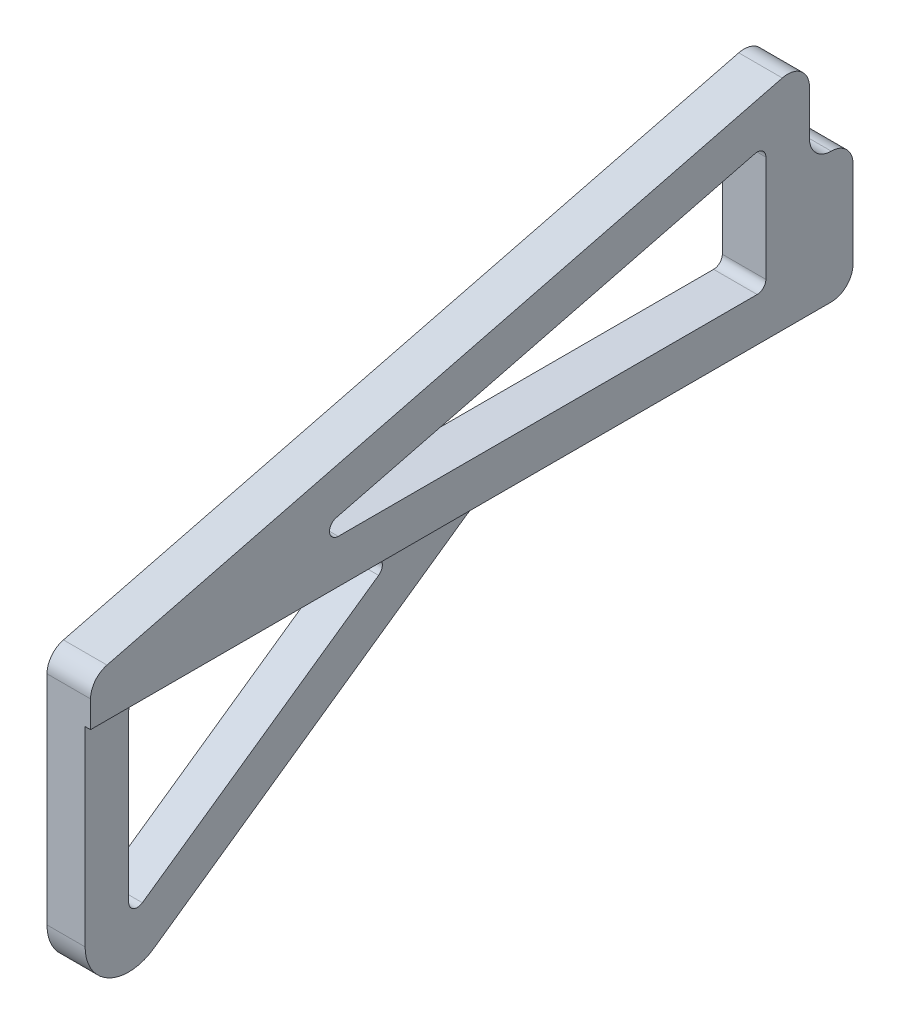
ISO-10303-21;
HEADER;
FILE_DESCRIPTION(('STEP AP214'),'2;1');
FILE_NAME('part.step','',(''),(''),'','','');
FILE_SCHEMA(('AUTOMOTIVE_DESIGN { 1 0 10303 214 1 1 1 1 }'));
ENDSEC;
DATA;
#1=APPLICATION_CONTEXT('core data for automotive mechanical design processes');
#2=APPLICATION_PROTOCOL_DEFINITION('international standard','automotive_design',2000,#1);
#3=PRODUCT_CONTEXT('',#1,'mechanical');
#4=PRODUCT('Part','Part','',(#3));
#5=PRODUCT_RELATED_PRODUCT_CATEGORY('part','',(#4));
#6=PRODUCT_DEFINITION_FORMATION('','',#4);
#7=PRODUCT_DEFINITION_CONTEXT('part definition',#1,'design');
#8=PRODUCT_DEFINITION('design','',#6,#7);
#9=PRODUCT_DEFINITION_SHAPE('','',#8);
#10=(LENGTH_UNIT() NAMED_UNIT(*) SI_UNIT(.MILLI.,.METRE.));
#11=(NAMED_UNIT(*) PLANE_ANGLE_UNIT() SI_UNIT($,.RADIAN.));
#12=(NAMED_UNIT(*) SI_UNIT($,.STERADIAN.) SOLID_ANGLE_UNIT());
#13=UNCERTAINTY_MEASURE_WITH_UNIT(LENGTH_MEASURE(1.E-05),#10,'distance_accuracy_value','');
#14=(GEOMETRIC_REPRESENTATION_CONTEXT(3) GLOBAL_UNCERTAINTY_ASSIGNED_CONTEXT((#13)) GLOBAL_UNIT_ASSIGNED_CONTEXT((#10,
#11,#12)) REPRESENTATION_CONTEXT('',''));
#15=CARTESIAN_POINT('',(0.,0.,0.));
#16=DIRECTION('',(0.,0.,1.));
#17=DIRECTION('',(1.,0.,0.));
#18=AXIS2_PLACEMENT_3D('',#15,#16,#17);
#19=CARTESIAN_POINT('',(0.,-156.794285130241,-10.8702420872809));
#20=DIRECTION('',(1.,0.,0.));
#21=DIRECTION('',(0.,0.,-1.));
#22=AXIS2_PLACEMENT_3D('',#19,#20,#21);
#23=PLANE('',#22);
#24=DIRECTION('',(0.,0.245169857615368,-0.969480139516463));
#25=VECTOR('',#24,1.);
#26=CARTESIAN_POINT('',(0.,-58.2070633333334,228.6));
#27=LINE('',#26,#25);
#28=CARTESIAN_POINT('',(0.,-56.9949279808075,223.806828595858));
#29=VERTEX_POINT('',#28);
#30=CARTESIAN_POINT('',(0.,-7.21393247154817,26.9568285958576));
#31=VERTEX_POINT('',#30);
#32=EDGE_CURVE('E211',#29,#31,#27,.T.);
#33=ORIENTED_EDGE('',*,*,#32,.F.);
#34=CARTESIAN_POINT('',(0.,-63.151126866737,222.25));
#35=DIRECTION('',(1.,0.,0.));
#36=DIRECTION('',(0.,0.,-1.));
#37=AXIS2_PLACEMENT_3D('',#34,#35,#36);
#38=CIRCLE('',#37,6.35);
#39=CARTESIAN_POINT('',(0.,-63.151126866737,228.6));
#40=VERTEX_POINT('',#39);
#41=EDGE_CURVE('E282',#40,#29,#38,.F.);
#42=ORIENTED_EDGE('',*,*,#41,.F.);
#43=DIRECTION('',(0.,1.,0.));
#44=VECTOR('',#43,1.);
#45=CARTESIAN_POINT('',(0.,-70.9070633333334,228.6));
#46=LINE('',#45,#44);
#47=CARTESIAN_POINT('',(0.,-70.9070633333334,228.6));
#48=VERTEX_POINT('',#47);
#49=EDGE_CURVE('E220',#48,#40,#46,.T.);
#50=ORIENTED_EDGE('',*,*,#49,.F.);
#51=DIRECTION('',(0.,0.,1.));
#52=VECTOR('',#51,1.);
#53=CARTESIAN_POINT('',(0.,-70.9070633333333,0.));
#54=LINE('',#53,#52);
#55=CARTESIAN_POINT('',(0.,-70.9070633333335,12.7));
#56=VERTEX_POINT('',#55);
#57=EDGE_CURVE('E219',#56,#48,#54,.T.);
#58=ORIENTED_EDGE('',*,*,#57,.F.);
#59=CARTESIAN_POINT('',(0.,-64.5570633333333,12.7));
#60=DIRECTION('',(1.,0.,0.));
#61=DIRECTION('',(0.,0.,-1.));
#62=AXIS2_PLACEMENT_3D('',#59,#60,#61);
#63=CIRCLE('',#62,6.35);
#64=CARTESIAN_POINT('',(0.,-64.5570633333333,6.35));
#65=VERTEX_POINT('',#64);
#66=EDGE_CURVE('E235',#56,#65,#63,.T.);
#67=ORIENTED_EDGE('',*,*,#66,.T.);
#68=DIRECTION('',(0.,-1.,0.));
#69=VECTOR('',#68,1.);
#70=CARTESIAN_POINT('',(0.,-70.9070633333333,6.35));
#71=LINE('',#70,#69);
#72=CARTESIAN_POINT('',(0.,-39.1570633333333,6.35));
#73=VERTEX_POINT('',#72);
#74=EDGE_CURVE('E44',#73,#65,#71,.T.);
#75=ORIENTED_EDGE('',*,*,#74,.F.);
#76=CARTESIAN_POINT('',(0.,-39.1570633333333,12.7));
#77=DIRECTION('',(1.,0.,0.));
#78=DIRECTION('',(0.,0.,-1.));
#79=AXIS2_PLACEMENT_3D('',#76,#77,#78);
#80=CIRCLE('',#79,6.35);
#81=CARTESIAN_POINT('',(0.,-32.8070633333333,12.7));
#82=VERTEX_POINT('',#81);
#83=EDGE_CURVE('E301',#73,#82,#80,.T.);
#84=ORIENTED_EDGE('',*,*,#83,.T.);
#85=CARTESIAN_POINT('',(0.,-26.4570633333333,12.7));
#86=DIRECTION('',(1.,0.,0.));
#87=DIRECTION('',(0.,0.,-1.));
#88=AXIS2_PLACEMENT_3D('',#85,#86,#87);
#89=CIRCLE('',#88,6.35);
#90=CARTESIAN_POINT('',(0.,-26.4570633333333,19.05));
#91=VERTEX_POINT('',#90);
#92=EDGE_CURVE('E238',#82,#91,#89,.F.);
#93=ORIENTED_EDGE('',*,*,#92,.T.);
#94=DIRECTION('',(0.,1.,0.));
#95=VECTOR('',#94,1.);
#96=CARTESIAN_POINT('',(0.,-5.21439069444444,19.05));
#97=LINE('',#96,#95);
#98=CARTESIAN_POINT('',(0.,-13.3701313574777,19.05));
#99=VERTEX_POINT('',#98);
#100=EDGE_CURVE('E39',#91,#99,#97,.T.);
#101=ORIENTED_EDGE('',*,*,#100,.T.);
#102=CARTESIAN_POINT('',(0.,-13.3701313574777,25.4));
#103=DIRECTION('',(1.,0.,0.));
#104=DIRECTION('',(0.,0.,-1.));
#105=AXIS2_PLACEMENT_3D('',#102,#103,#104);
#106=CIRCLE('',#105,6.35);
#107=EDGE_CURVE('E226',#99,#31,#106,.T.);
#108=ORIENTED_EDGE('',*,*,#107,.T.);
#109=EDGE_LOOP('',(#33,#42,#50,#58,#67,#75,#84,#93,#101,#108));
#110=FACE_BOUND('',#109,.T.);
#111=DIRECTION('',(0.,1.,0.));
#112=VECTOR('',#111,1.);
#113=CARTESIAN_POINT('',(0.,-58.2070633333334,31.75));
#114=LINE('',#113,#112);
#115=CARTESIAN_POINT('',(0.,-55.6670633333334,31.75));
#116=VERTEX_POINT('',#115);
#117=CARTESIAN_POINT('',(0.,-24.7881682857246,31.75));
#118=VERTEX_POINT('',#117);
#119=EDGE_CURVE('E278',#116,#118,#114,.T.);
#120=ORIENTED_EDGE('',*,*,#119,.F.);
#121=CARTESIAN_POINT('',(0.,-55.6670633333334,34.29));
#122=DIRECTION('',(1.,0.,0.));
#123=DIRECTION('',(0.,0.,-1.));
#124=AXIS2_PLACEMENT_3D('',#121,#122,#123);
#125=CIRCLE('',#124,2.54);
#126=CARTESIAN_POINT('',(0.,-58.2070633333334,34.29));
#127=VERTEX_POINT('',#126);
#128=EDGE_CURVE('E292',#116,#127,#125,.F.);
#129=ORIENTED_EDGE('',*,*,#128,.T.);
#130=DIRECTION('',(0.,0.,1.));
#131=VECTOR('',#130,1.);
#132=CARTESIAN_POINT('',(0.,-58.2070633333334,176.79917862854));
#133=LINE('',#132,#131);
#134=CARTESIAN_POINT('',(0.,-58.2070633333334,156.395040848194));
#135=VERTEX_POINT('',#134);
#136=EDGE_CURVE('E286',#127,#135,#133,.T.);
#137=ORIENTED_EDGE('',*,*,#136,.T.);
#138=CARTESIAN_POINT('',(0.,-55.6670633333334,156.395040848194));
#139=DIRECTION('',(1.,0.,0.));
#140=DIRECTION('',(0.,0.,-1.));
#141=AXIS2_PLACEMENT_3D('',#138,#139,#140);
#142=CIRCLE('',#141,2.54);
#143=CARTESIAN_POINT('',(0.,-53.2045837789615,157.017772286537));
#144=VERTEX_POINT('',#143);
#145=EDGE_CURVE('E298',#135,#144,#142,.F.);
#146=ORIENTED_EDGE('',*,*,#145,.T.);
#147=DIRECTION('',(0.,0.245169857615365,-0.969480139516464));
#148=VECTOR('',#147,1.);
#149=CARTESIAN_POINT('',(0.,-50.792110364231,147.478079742594));
#150=LINE('',#149,#148);
#151=CARTESIAN_POINT('',(0.,-22.3256887313528,34.912731438343));
#152=VERTEX_POINT('',#151);
#153=EDGE_CURVE('E289',#144,#152,#150,.T.);
#154=ORIENTED_EDGE('',*,*,#153,.T.);
#155=CARTESIAN_POINT('',(0.,-24.7881682857246,34.29));
#156=DIRECTION('',(1.,0.,0.));
#157=DIRECTION('',(0.,0.,-1.));
#158=AXIS2_PLACEMENT_3D('',#155,#156,#157);
#159=CIRCLE('',#158,2.54);
#160=EDGE_CURVE('E295',#152,#118,#159,.F.);
#161=ORIENTED_EDGE('',*,*,#160,.T.);
#162=EDGE_LOOP('',(#120,#129,#137,#146,#154,#161));
#163=FACE_BOUND('',#162,.T.);
#164=ADVANCED_FACE('F35',(#110,#163),#23,.T.);
#165=CARTESIAN_POINT('',(-12.7,-84.3286324115797,155.609761430837));
#166=DIRECTION('',(0.,-0.819152044288993,-0.573576436351045));
#167=DIRECTION('',(0.,0.573576436351045,-0.819152044288993));
#168=AXIS2_PLACEMENT_3D('',#165,#166,#167);
#169=PLANE('',#168);
#170=DIRECTION('',(0.,-0.573576436351045,0.819152044288993));
#171=VECTOR('',#170,1.);
#172=CARTESIAN_POINT('',(-1.5875,-84.3286324115797,155.609761430837));
#173=LINE('',#172,#171);
#174=CARTESIAN_POINT('',(-1.5875,-75.5277095258274,143.040740954059));
#175=VERTEX_POINT('',#174);
#176=CARTESIAN_POINT('',(-1.58749999999999,-123.745663528157,211.903115851668));
#177=VERTEX_POINT('',#176);
#178=EDGE_CURVE('E230',#175,#177,#173,.T.);
#179=ORIENTED_EDGE('',*,*,#178,.F.);
#180=DIRECTION('',(1.,0.,0.));
#181=VECTOR('',#180,1.);
#182=CARTESIAN_POINT('',(-12.7,-75.5277095258274,143.040740954059));
#183=LINE('',#182,#181);
#184=CARTESIAN_POINT('',(-12.7,-75.5277095258274,143.040740954059));
#185=VERTEX_POINT('',#184);
#186=EDGE_CURVE('E390',#175,#185,#183,.F.);
#187=ORIENTED_EDGE('',*,*,#186,.T.);
#188=DIRECTION('',(0.,0.573576436351044,-0.819152044288993));
#189=VECTOR('',#188,1.);
#190=CARTESIAN_POINT('',(-12.7,-126.544311938169,215.9));
#191=LINE('',#190,#189);
#192=CARTESIAN_POINT('',(-12.7,-123.745663528157,211.903115851668));
#193=VERTEX_POINT('',#192);
#194=EDGE_CURVE('E248',#193,#185,#191,.T.);
#195=ORIENTED_EDGE('',*,*,#194,.F.);
#196=DIRECTION('',(1.,0.,0.));
#197=VECTOR('',#196,1.);
#198=CARTESIAN_POINT('',(-1.58749999999999,-123.745663528157,211.903115851668));
#199=LINE('',#198,#197);
#200=EDGE_CURVE('E369',#193,#177,#199,.T.);
#201=ORIENTED_EDGE('',*,*,#200,.T.);
#202=EDGE_LOOP('',(#179,#187,#195,#201));
#203=FACE_BOUND('',#202,.T.);
#204=ADVANCED_FACE('F406',(#203),#169,.F.);
#205=CARTESIAN_POINT('',(-12.7,-121.665017335663,213.36));
#206=DIRECTION('',(-1.,0.,0.));
#207=DIRECTION('',(0.,0.,1.));
#208=AXIS2_PLACEMENT_3D('',#205,#206,#207);
#209=CYLINDRICAL_SURFACE('',#208,2.54);
#210=CARTESIAN_POINT('',(-12.7,-121.665017335663,213.36));
#211=DIRECTION('',(-1.,0.,0.));
#212=DIRECTION('',(0.,0.,1.));
#213=AXIS2_PLACEMENT_3D('',#210,#211,#212);
#214=CIRCLE('',#213,2.54);
#215=CARTESIAN_POINT('',(-12.7,-121.665017335663,215.9));
#216=VERTEX_POINT('',#215);
#217=EDGE_CURVE('E358',#216,#193,#214,.F.);
#218=ORIENTED_EDGE('',*,*,#217,.F.);
#219=DIRECTION('',(1.,0.,0.));
#220=VECTOR('',#219,1.);
#221=CARTESIAN_POINT('',(-12.7,-121.665017335663,215.9));
#222=LINE('',#221,#220);
#223=CARTESIAN_POINT('',(-1.58749999999999,-121.665017335663,215.9));
#224=VERTEX_POINT('',#223);
#225=EDGE_CURVE('E308',#224,#216,#222,.F.);
#226=ORIENTED_EDGE('',*,*,#225,.F.);
#227=CARTESIAN_POINT('',(-1.58749999999999,-121.665017335663,213.36));
#228=DIRECTION('',(1.,0.,0.));
#229=DIRECTION('',(0.,1.,0.));
#230=AXIS2_PLACEMENT_3D('',#227,#228,#229);
#231=CIRCLE('',#230,2.54);
#232=EDGE_CURVE('E370',#177,#224,#231,.F.);
#233=ORIENTED_EDGE('',*,*,#232,.F.);
#234=ORIENTED_EDGE('',*,*,#200,.F.);
#235=EDGE_LOOP('',(#218,#226,#233,#234));
#236=FACE_BOUND('',#235,.T.);
#237=ADVANCED_FACE('F367',(#236),#209,.F.);
#238=CARTESIAN_POINT('',(-12.7,-70.9070633333334,215.9));
#239=DIRECTION('',(0.,0.,1.));
#240=DIRECTION('',(1.,0.,0.));
#241=AXIS2_PLACEMENT_3D('',#238,#239,#240);
#242=PLANE('',#241);
#243=DIRECTION('',(0.,-1.,0.));
#244=VECTOR('',#243,1.);
#245=CARTESIAN_POINT('',(-12.7,-70.9070633333334,215.9));
#246=LINE('',#245,#244);
#247=CARTESIAN_POINT('',(-12.7,-73.4470633333334,215.9));
#248=VERTEX_POINT('',#247);
#249=EDGE_CURVE('E259',#248,#216,#246,.T.);
#250=ORIENTED_EDGE('',*,*,#249,.F.);
#251=DIRECTION('',(1.,0.,0.));
#252=VECTOR('',#251,1.);
#253=CARTESIAN_POINT('',(-12.7,-73.4470633333334,215.9));
#254=LINE('',#253,#252);
#255=CARTESIAN_POINT('',(-1.5875,-73.4470633333334,215.9));
#256=VERTEX_POINT('',#255);
#257=EDGE_CURVE('E397',#248,#256,#254,.T.);
#258=ORIENTED_EDGE('',*,*,#257,.T.);
#259=DIRECTION('',(0.,1.,0.));
#260=VECTOR('',#259,1.);
#261=CARTESIAN_POINT('',(-1.5875,-70.9070633333334,215.9));
#262=LINE('',#261,#260);
#263=EDGE_CURVE('E264',#224,#256,#262,.T.);
#264=ORIENTED_EDGE('',*,*,#263,.F.);
#265=ORIENTED_EDGE('',*,*,#225,.T.);
#266=EDGE_LOOP('',(#250,#258,#264,#265));
#267=FACE_BOUND('',#266,.T.);
#268=ADVANCED_FACE('F399',(#267),#242,.F.);
#269=CARTESIAN_POINT('',(-12.7,-70.9070633333334,114.3));
#270=DIRECTION('',(0.,-0.819152044288991,-0.573576436351047));
#271=DIRECTION('',(0.,0.573576436351047,-0.819152044288991));
#272=AXIS2_PLACEMENT_3D('',#269,#270,#271);
#273=PLANE('',#272);
#274=DIRECTION('',(0.,0.573576436351048,-0.81915204428899));
#275=VECTOR('',#274,1.);
#276=CARTESIAN_POINT('',(-12.7,-114.259665205677,176.213931951071));
#277=LINE('',#276,#275);
#278=CARTESIAN_POINT('',(-12.7,-136.94754290064,208.615579258342));
#279=VERTEX_POINT('',#278);
#280=CARTESIAN_POINT('',(-12.7,-73.2038323708631,117.580126122895));
#281=VERTEX_POINT('',#280);
#282=EDGE_CURVE('E342',#279,#281,#277,.T.);
#283=ORIENTED_EDGE('',*,*,#282,.T.);
#284=DIRECTION('',(1.,0.,0.));
#285=VECTOR('',#284,1.);
#286=CARTESIAN_POINT('',(-1.5875,-73.2038323708632,117.580126122895));
#287=LINE('',#286,#285);
#288=CARTESIAN_POINT('',(-1.5875,-73.2038323708632,117.580126122895));
#289=VERTEX_POINT('',#288);
#290=EDGE_CURVE('E526',#281,#289,#287,.T.);
#291=ORIENTED_EDGE('',*,*,#290,.T.);
#292=DIRECTION('',(0.,-0.573576436351047,0.819152044288991));
#293=VECTOR('',#292,1.);
#294=CARTESIAN_POINT('',(-1.5875,-70.9070633333334,114.3));
#295=LINE('',#294,#293);
#296=CARTESIAN_POINT('',(-1.58749999999999,-136.94754290064,208.615579258342));
#297=VERTEX_POINT('',#296);
#298=EDGE_CURVE('E247',#289,#297,#295,.T.);
#299=ORIENTED_EDGE('',*,*,#298,.T.);
#300=DIRECTION('',(1.,0.,0.));
#301=VECTOR('',#300,1.);
#302=CARTESIAN_POINT('',(-12.7,-136.94754290064,208.615579258342));
#303=LINE('',#302,#301);
#304=EDGE_CURVE('E375',#297,#279,#303,.F.);
#305=ORIENTED_EDGE('',*,*,#304,.T.);
#306=EDGE_LOOP('',(#283,#291,#299,#305));
#307=FACE_BOUND('',#306,.T.);
#308=ADVANCED_FACE('F440',(#307),#273,.T.);
#309=CARTESIAN_POINT('',(-12.7,-126.544311938169,215.9));
#310=DIRECTION('',(1.,0.,0.));
#311=DIRECTION('',(0.,0.,-1.));
#312=AXIS2_PLACEMENT_3D('',#309,#310,#311);
#313=CYLINDRICAL_SURFACE('',#312,12.7);
#314=CARTESIAN_POINT('',(-12.7,-126.544311938169,215.9));
#315=DIRECTION('',(-1.,0.,0.));
#316=DIRECTION('',(0.,0.,1.));
#317=AXIS2_PLACEMENT_3D('',#314,#315,#316);
#318=CIRCLE('',#317,12.7);
#319=CARTESIAN_POINT('',(-12.7,-126.544311938169,228.6));
#320=VERTEX_POINT('',#319);
#321=EDGE_CURVE('E518',#279,#320,#318,.T.);
#322=ORIENTED_EDGE('',*,*,#321,.F.);
#323=ORIENTED_EDGE('',*,*,#304,.F.);
#324=CARTESIAN_POINT('',(-1.58749999999999,-126.544311938169,215.9));
#325=DIRECTION('',(1.,0.,0.));
#326=DIRECTION('',(0.,1.,0.));
#327=AXIS2_PLACEMENT_3D('',#324,#325,#326);
#328=CIRCLE('',#327,12.7);
#329=CARTESIAN_POINT('',(-1.58749999999999,-126.544311938169,228.6));
#330=VERTEX_POINT('',#329);
#331=EDGE_CURVE('E520',#330,#297,#328,.T.);
#332=ORIENTED_EDGE('',*,*,#331,.F.);
#333=DIRECTION('',(1.,0.,0.));
#334=VECTOR('',#333,1.);
#335=CARTESIAN_POINT('',(-12.7,-126.544311938169,228.6));
#336=LINE('',#335,#334);
#337=EDGE_CURVE('E522',#320,#330,#336,.T.);
#338=ORIENTED_EDGE('',*,*,#337,.F.);
#339=EDGE_LOOP('',(#322,#323,#332,#338));
#340=FACE_BOUND('',#339,.T.);
#341=ADVANCED_FACE('F538',(#340),#313,.T.);
#342=CARTESIAN_POINT('',(-12.7,-83.6070633333333,110.295705381237));
#343=DIRECTION('',(-1.,0.,0.));
#344=DIRECTION('',(0.,0.,1.));
#345=AXIS2_PLACEMENT_3D('',#342,#343,#344);
#346=CYLINDRICAL_SURFACE('',#345,12.7);
#347=CARTESIAN_POINT('',(-12.7,-83.6070633333333,110.295705381237));
#348=DIRECTION('',(-1.,0.,0.));
#349=DIRECTION('',(0.,0.,1.));
#350=AXIS2_PLACEMENT_3D('',#347,#348,#349);
#351=CIRCLE('',#350,12.7);
#352=CARTESIAN_POINT('',(-12.7,-70.9070633333334,110.295705381237));
#353=VERTEX_POINT('',#352);
#354=EDGE_CURVE('E513',#353,#281,#351,.F.);
#355=ORIENTED_EDGE('',*,*,#354,.F.);
#356=DIRECTION('',(1.,0.,0.));
#357=VECTOR('',#356,1.);
#358=CARTESIAN_POINT('',(-12.7,-70.9070633333333,110.295705381237));
#359=LINE('',#358,#357);
#360=CARTESIAN_POINT('',(-1.5875,-70.9070633333333,110.295705381237));
#361=VERTEX_POINT('',#360);
#362=EDGE_CURVE('E524',#361,#353,#359,.F.);
#363=ORIENTED_EDGE('',*,*,#362,.F.);
#364=CARTESIAN_POINT('',(-1.5875,-83.6070633333333,110.295705381237));
#365=DIRECTION('',(1.,0.,0.));
#366=DIRECTION('',(0.,1.,0.));
#367=AXIS2_PLACEMENT_3D('',#364,#365,#366);
#368=CIRCLE('',#367,12.7);
#369=EDGE_CURVE('E515',#289,#361,#368,.F.);
#370=ORIENTED_EDGE('',*,*,#369,.F.);
#371=ORIENTED_EDGE('',*,*,#290,.F.);
#372=EDGE_LOOP('',(#355,#363,#370,#371));
#373=FACE_BOUND('',#372,.T.);
#374=ADVANCED_FACE('F424',(#373),#346,.F.);
#375=CARTESIAN_POINT('',(-12.7,-73.4470633333334,144.49762510239));
#376=DIRECTION('',(1.,0.,0.));
#377=DIRECTION('',(0.,0.,-1.));
#378=AXIS2_PLACEMENT_3D('',#375,#376,#377);
#379=CYLINDRICAL_SURFACE('',#378,2.54);
#380=CARTESIAN_POINT('',(-12.7,-73.4470633333334,144.49762510239));
#381=DIRECTION('',(-1.,0.,0.));
#382=DIRECTION('',(0.,0.,1.));
#383=AXIS2_PLACEMENT_3D('',#380,#381,#382);
#384=CIRCLE('',#383,2.54);
#385=CARTESIAN_POINT('',(-12.7,-70.9070633333333,144.49762510239));
#386=VERTEX_POINT('',#385);
#387=EDGE_CURVE('E373',#185,#386,#384,.F.);
#388=ORIENTED_EDGE('',*,*,#387,.F.);
#389=ORIENTED_EDGE('',*,*,#186,.F.);
#390=CARTESIAN_POINT('',(-1.5875,-73.4470633333334,144.49762510239));
#391=DIRECTION('',(1.,0.,0.));
#392=DIRECTION('',(0.,1.,0.));
#393=AXIS2_PLACEMENT_3D('',#390,#391,#392);
#394=CIRCLE('',#393,2.54);
#395=CARTESIAN_POINT('',(-1.5875,-70.9070633333334,144.49762510239));
#396=VERTEX_POINT('',#395);
#397=EDGE_CURVE('E380',#396,#175,#394,.F.);
#398=ORIENTED_EDGE('',*,*,#397,.F.);
#399=DIRECTION('',(1.,0.,0.));
#400=VECTOR('',#399,1.);
#401=CARTESIAN_POINT('',(-12.7,-70.9070633333334,144.49762510239));
#402=LINE('',#401,#400);
#403=EDGE_CURVE('E395',#386,#396,#402,.T.);
#404=ORIENTED_EDGE('',*,*,#403,.F.);
#405=EDGE_LOOP('',(#388,#389,#398,#404));
#406=FACE_BOUND('',#405,.T.);
#407=ADVANCED_FACE('F410',(#406),#379,.F.);
#408=CARTESIAN_POINT('',(-12.7,-73.4470633333334,213.36));
#409=DIRECTION('',(1.,0.,0.));
#410=DIRECTION('',(0.,0.,-1.));
#411=AXIS2_PLACEMENT_3D('',#408,#409,#410);
#412=CYLINDRICAL_SURFACE('',#411,2.54);
#413=CARTESIAN_POINT('',(-12.7,-73.4470633333334,213.36));
#414=DIRECTION('',(-1.,0.,0.));
#415=DIRECTION('',(0.,0.,1.));
#416=AXIS2_PLACEMENT_3D('',#413,#414,#415);
#417=CIRCLE('',#416,2.54);
#418=CARTESIAN_POINT('',(-12.7,-70.9070633333333,213.36));
#419=VERTEX_POINT('',#418);
#420=EDGE_CURVE('E360',#419,#248,#417,.F.);
#421=ORIENTED_EDGE('',*,*,#420,.F.);
#422=DIRECTION('',(1.,0.,0.));
#423=VECTOR('',#422,1.);
#424=CARTESIAN_POINT('',(-12.7,-70.9070633333334,213.36));
#425=LINE('',#424,#423);
#426=CARTESIAN_POINT('',(-1.5875,-70.9070633333334,213.36));
#427=VERTEX_POINT('',#426);
#428=EDGE_CURVE('E393',#427,#419,#425,.F.);
#429=ORIENTED_EDGE('',*,*,#428,.F.);
#430=CARTESIAN_POINT('',(-1.5875,-73.4470633333334,213.36));
#431=DIRECTION('',(1.,0.,0.));
#432=DIRECTION('',(0.,1.,0.));
#433=AXIS2_PLACEMENT_3D('',#430,#431,#432);
#434=CIRCLE('',#433,2.54);
#435=EDGE_CURVE('E383',#256,#427,#434,.F.);
#436=ORIENTED_EDGE('',*,*,#435,.F.);
#437=ORIENTED_EDGE('',*,*,#257,.F.);
#438=EDGE_LOOP('',(#421,#429,#436,#437));
#439=FACE_BOUND('',#438,.T.);
#440=ADVANCED_FACE('F416',(#439),#412,.F.);
#441=CARTESIAN_POINT('',(-1.5875,-70.9070633333334,231.14));
#442=DIRECTION('',(1.,0.,0.));
#443=DIRECTION('',(0.,1.,0.));
#444=AXIS2_PLACEMENT_3D('',#441,#442,#443);
#445=PLANE('',#444);
#446=DIRECTION('',(0.,1.,0.));
#447=VECTOR('',#446,1.);
#448=CARTESIAN_POINT('',(-1.5875,-70.9070633333334,228.6));
#449=LINE('',#448,#447);
#450=CARTESIAN_POINT('',(-1.5875,-70.9070633333334,228.6));
#451=VERTEX_POINT('',#450);
#452=EDGE_CURVE('E52',#330,#451,#449,.T.);
#453=ORIENTED_EDGE('',*,*,#452,.F.);
#454=ORIENTED_EDGE('',*,*,#331,.T.);
#455=ORIENTED_EDGE('',*,*,#298,.F.);
#456=ORIENTED_EDGE('',*,*,#369,.T.);
#457=DIRECTION('',(0.,0.,-1.));
#458=VECTOR('',#457,1.);
#459=CARTESIAN_POINT('',(-1.5875,-70.9070633333334,231.14));
#460=LINE('',#459,#458);
#461=EDGE_CURVE('E268',#396,#361,#460,.T.);
#462=ORIENTED_EDGE('',*,*,#461,.F.);
#463=ORIENTED_EDGE('',*,*,#397,.T.);
#464=ORIENTED_EDGE('',*,*,#178,.T.);
#465=ORIENTED_EDGE('',*,*,#232,.T.);
#466=ORIENTED_EDGE('',*,*,#263,.T.);
#467=ORIENTED_EDGE('',*,*,#435,.T.);
#468=EDGE_CURVE('E267',#451,#427,#460,.T.);
#469=ORIENTED_EDGE('',*,*,#468,.F.);
#470=EDGE_LOOP('',(#453,#454,#455,#456,#462,#463,#464,#465,#466,#467,#469));
#471=FACE_BOUND('',#470,.T.);
#472=ADVANCED_FACE('F401',(#471),#445,.T.);
#473=CARTESIAN_POINT('',(-12.7,-58.2070633333334,228.6));
#474=DIRECTION('',(0.,0.969480139516463,0.245169857615368));
#475=DIRECTION('',(0.,-0.245169857615368,0.969480139516463));
#476=AXIS2_PLACEMENT_3D('',#473,#474,#475);
#477=PLANE('',#476);
#478=DIRECTION('',(1.,0.,0.));
#479=VECTOR('',#478,1.);
#480=CARTESIAN_POINT('',(-12.7,-56.9949279808075,223.806828595858));
#481=LINE('',#480,#479);
#482=CARTESIAN_POINT('',(-12.7,-56.9949279808075,223.806828595858));
#483=VERTEX_POINT('',#482);
#484=EDGE_CURVE('E216',#483,#29,#481,.T.);
#485=ORIENTED_EDGE('',*,*,#484,.T.);
#486=ORIENTED_EDGE('',*,*,#32,.T.);
#487=DIRECTION('',(-1.,0.,0.));
#488=VECTOR('',#487,1.);
#489=CARTESIAN_POINT('',(-12.7,-7.21393247154818,26.9568285958576));
#490=LINE('',#489,#488);
#491=CARTESIAN_POINT('',(-12.7,-7.21393247154818,26.9568285958576));
#492=VERTEX_POINT('',#491);
#493=EDGE_CURVE('E214',#31,#492,#490,.T.);
#494=ORIENTED_EDGE('',*,*,#493,.T.);
#495=DIRECTION('',(0.,-0.245169857615368,0.969480139516463));
#496=VECTOR('',#495,1.);
#497=CARTESIAN_POINT('',(-12.7,-58.2070633333334,228.6));
#498=LINE('',#497,#496);
#499=EDGE_CURVE('E60',#492,#483,#498,.T.);
#500=ORIENTED_EDGE('',*,*,#499,.T.);
#501=EDGE_LOOP('',(#485,#486,#494,#500));
#502=FACE_BOUND('',#501,.T.);
#503=ADVANCED_FACE('F213',(#502),#477,.T.);
#504=CARTESIAN_POINT('',(-12.7,-70.9070633333333,0.));
#505=DIRECTION('',(0.,-1.,0.));
#506=DIRECTION('',(0.,0.,-1.));
#507=AXIS2_PLACEMENT_3D('',#504,#505,#506);
#508=PLANE('',#507);
#509=DIRECTION('',(1.,0.,0.));
#510=VECTOR('',#509,1.);
#511=CARTESIAN_POINT('',(0.,-70.9070633333333,12.7));
#512=LINE('',#511,#510);
#513=CARTESIAN_POINT('',(-12.7,-70.9070633333333,12.7));
#514=VERTEX_POINT('',#513);
#515=EDGE_CURVE('E329',#514,#56,#512,.T.);
#516=ORIENTED_EDGE('',*,*,#515,.T.);
#517=ORIENTED_EDGE('',*,*,#57,.T.);
#518=DIRECTION('',(1.,0.,0.));
#519=VECTOR('',#518,1.);
#520=CARTESIAN_POINT('',(-12.7,-70.9070633333334,228.6));
#521=LINE('',#520,#519);
#522=EDGE_CURVE('E246',#451,#48,#521,.T.);
#523=ORIENTED_EDGE('',*,*,#522,.F.);
#524=ORIENTED_EDGE('',*,*,#468,.T.);
#525=ORIENTED_EDGE('',*,*,#428,.T.);
#526=DIRECTION('',(0.,0.,1.));
#527=VECTOR('',#526,1.);
#528=CARTESIAN_POINT('',(-12.7,-70.9070633333333,136.441774304388));
#529=LINE('',#528,#527);
#530=EDGE_CURVE('E253',#386,#419,#529,.T.);
#531=ORIENTED_EDGE('',*,*,#530,.F.);
#532=ORIENTED_EDGE('',*,*,#403,.T.);
#533=ORIENTED_EDGE('',*,*,#461,.T.);
#534=ORIENTED_EDGE('',*,*,#362,.T.);
#535=DIRECTION('',(0.,0.,-1.));
#536=VECTOR('',#535,1.);
#537=CARTESIAN_POINT('',(-12.7,-70.9070633333334,114.3));
#538=LINE('',#537,#536);
#539=EDGE_CURVE('E245',#353,#514,#538,.T.);
#540=ORIENTED_EDGE('',*,*,#539,.T.);
#541=EDGE_LOOP('',(#516,#517,#523,#524,#525,#531,#532,#533,#534,#540));
#542=FACE_BOUND('',#541,.T.);
#543=ADVANCED_FACE('F414',(#542),#508,.T.);
#544=CARTESIAN_POINT('',(51.5100393822405,-58.2070633333334,31.75));
#545=DIRECTION('',(0.,0.,1.));
#546=DIRECTION('',(0.,-1.,0.));
#547=AXIS2_PLACEMENT_3D('',#544,#545,#546);
#548=PLANE('',#547);
#549=DIRECTION('',(-1.,0.,0.));
#550=VECTOR('',#549,1.);
#551=CARTESIAN_POINT('',(51.5100393822405,-55.6670633333334,31.75));
#552=LINE('',#551,#550);
#553=CARTESIAN_POINT('',(-12.7,-55.6670633333334,31.75));
#554=VERTEX_POINT('',#553);
#555=EDGE_CURVE('E310',#554,#116,#552,.F.);
#556=ORIENTED_EDGE('',*,*,#555,.T.);
#557=ORIENTED_EDGE('',*,*,#119,.T.);
#558=DIRECTION('',(-1.,0.,0.));
#559=VECTOR('',#558,1.);
#560=CARTESIAN_POINT('',(51.5100393822405,-24.7881682857246,31.75));
#561=LINE('',#560,#559);
#562=CARTESIAN_POINT('',(-12.7,-24.7881682857246,31.75));
#563=VERTEX_POINT('',#562);
#564=EDGE_CURVE('E312',#118,#563,#561,.T.);
#565=ORIENTED_EDGE('',*,*,#564,.T.);
#566=DIRECTION('',(0.,1.,0.));
#567=VECTOR('',#566,1.);
#568=CARTESIAN_POINT('',(-12.7,-58.2070633333334,31.75));
#569=LINE('',#568,#567);
#570=EDGE_CURVE('E272',#554,#563,#569,.T.);
#571=ORIENTED_EDGE('',*,*,#570,.F.);
#572=EDGE_LOOP('',(#556,#557,#565,#571));
#573=FACE_BOUND('',#572,.T.);
#574=ADVANCED_FACE('F459',(#573),#548,.T.);
#575=CARTESIAN_POINT('',(-12.7,-50.792110364231,147.478079742594));
#576=DIRECTION('',(0.,0.969480139516464,0.245169857615365));
#577=DIRECTION('',(0.,-0.245169857615365,0.969480139516464));
#578=AXIS2_PLACEMENT_3D('',#575,#576,#577);
#579=PLANE('',#578);
#580=ORIENTED_EDGE('',*,*,#153,.F.);
#581=DIRECTION('',(1.,0.,0.));
#582=VECTOR('',#581,1.);
#583=CARTESIAN_POINT('',(-12.7,-53.2045837789615,157.017772286537));
#584=LINE('',#583,#582);
#585=CARTESIAN_POINT('',(-12.7,-53.2045837789615,157.017772286537));
#586=VERTEX_POINT('',#585);
#587=EDGE_CURVE('E307',#144,#586,#584,.F.);
#588=ORIENTED_EDGE('',*,*,#587,.T.);
#589=DIRECTION('',(0.,-0.245169857615365,0.969480139516464));
#590=VECTOR('',#589,1.);
#591=CARTESIAN_POINT('',(-12.7,-50.792110364231,147.478079742594));
#592=LINE('',#591,#590);
#593=CARTESIAN_POINT('',(-12.7,-22.3256887313528,34.912731438343));
#594=VERTEX_POINT('',#593);
#595=EDGE_CURVE('E352',#594,#586,#592,.T.);
#596=ORIENTED_EDGE('',*,*,#595,.F.);
#597=DIRECTION('',(-1.,0.,0.));
#598=VECTOR('',#597,1.);
#599=CARTESIAN_POINT('',(-12.7,-22.3256887313528,34.912731438343));
#600=LINE('',#599,#598);
#601=EDGE_CURVE('E305',#594,#152,#600,.F.);
#602=ORIENTED_EDGE('',*,*,#601,.T.);
#603=EDGE_LOOP('',(#580,#588,#596,#602));
#604=FACE_BOUND('',#603,.T.);
#605=ADVANCED_FACE('F446',(#604),#579,.F.);
#606=CARTESIAN_POINT('',(0.,-5.21439069444444,19.05));
#607=DIRECTION('',(0.,0.,1.));
#608=DIRECTION('',(0.,-1.,0.));
#609=AXIS2_PLACEMENT_3D('',#606,#607,#608);
#610=PLANE('',#609);
#611=ORIENTED_EDGE('',*,*,#100,.F.);
#612=DIRECTION('',(1.,0.,0.));
#613=VECTOR('',#612,1.);
#614=CARTESIAN_POINT('',(-12.7,-26.4570633333333,19.05));
#615=LINE('',#614,#613);
#616=CARTESIAN_POINT('',(-12.7,-26.4570633333333,19.05));
#617=VERTEX_POINT('',#616);
#618=EDGE_CURVE('E503',#91,#617,#615,.F.);
#619=ORIENTED_EDGE('',*,*,#618,.T.);
#620=DIRECTION('',(0.,1.,0.));
#621=VECTOR('',#620,1.);
#622=CARTESIAN_POINT('',(-12.7,-5.21439069444444,19.05));
#623=LINE('',#622,#621);
#624=CARTESIAN_POINT('',(-12.7,-13.3701313574777,19.05));
#625=VERTEX_POINT('',#624);
#626=EDGE_CURVE('E270',#617,#625,#623,.T.);
#627=ORIENTED_EDGE('',*,*,#626,.T.);
#628=DIRECTION('',(-1.,0.,0.));
#629=VECTOR('',#628,1.);
#630=CARTESIAN_POINT('',(0.,-13.3701313574777,19.05));
#631=LINE('',#630,#629);
#632=EDGE_CURVE('E335',#625,#99,#631,.F.);
#633=ORIENTED_EDGE('',*,*,#632,.T.);
#634=EDGE_LOOP('',(#611,#619,#627,#633));
#635=FACE_BOUND('',#634,.T.);
#636=ADVANCED_FACE('F442',(#635),#610,.F.);
#637=CARTESIAN_POINT('',(-52.8609262841384,-70.9070633333333,6.35));
#638=DIRECTION('',(0.,0.,1.));
#639=DIRECTION('',(1.,0.,0.));
#640=AXIS2_PLACEMENT_3D('',#637,#638,#639);
#641=PLANE('',#640);
#642=DIRECTION('',(0.,-1.,0.));
#643=VECTOR('',#642,1.);
#644=CARTESIAN_POINT('',(-12.7,-70.9070633333333,6.35));
#645=LINE('',#644,#643);
#646=CARTESIAN_POINT('',(-12.7,-39.1570633333333,6.35));
#647=VERTEX_POINT('',#646);
#648=CARTESIAN_POINT('',(-12.7,-64.5570633333333,6.35));
#649=VERTEX_POINT('',#648);
#650=EDGE_CURVE('E275',#647,#649,#645,.T.);
#651=ORIENTED_EDGE('',*,*,#650,.F.);
#652=DIRECTION('',(1.,0.,0.));
#653=VECTOR('',#652,1.);
#654=CARTESIAN_POINT('',(-52.8609262841384,-39.1570633333333,6.35));
#655=LINE('',#654,#653);
#656=EDGE_CURVE('E510',#647,#73,#655,.T.);
#657=ORIENTED_EDGE('',*,*,#656,.T.);
#658=ORIENTED_EDGE('',*,*,#74,.T.);
#659=DIRECTION('',(1.,0.,0.));
#660=VECTOR('',#659,1.);
#661=CARTESIAN_POINT('',(-12.7,-64.5570633333333,6.35));
#662=LINE('',#661,#660);
#663=EDGE_CURVE('E322',#65,#649,#662,.F.);
#664=ORIENTED_EDGE('',*,*,#663,.T.);
#665=EDGE_LOOP('',(#651,#657,#658,#664));
#666=FACE_BOUND('',#665,.T.);
#667=ADVANCED_FACE('F445',(#666),#641,.F.);
#668=CARTESIAN_POINT('',(-52.8609262841384,-26.4570633333333,12.7));
#669=DIRECTION('',(-1.,0.,0.));
#670=DIRECTION('',(0.,0.,1.));
#671=AXIS2_PLACEMENT_3D('',#668,#669,#670);
#672=CYLINDRICAL_SURFACE('',#671,6.35);
#673=DIRECTION('',(1.,0.,0.));
#674=VECTOR('',#673,1.);
#675=CARTESIAN_POINT('',(0.,-32.8070633333333,12.7));
#676=LINE('',#675,#674);
#677=CARTESIAN_POINT('',(-12.7,-32.8070633333333,12.7));
#678=VERTEX_POINT('',#677);
#679=EDGE_CURVE('E11',#678,#82,#676,.T.);
#680=ORIENTED_EDGE('',*,*,#679,.F.);
#681=CARTESIAN_POINT('',(-12.7,-26.4570633333333,12.7));
#682=DIRECTION('',(-1.,0.,0.));
#683=DIRECTION('',(0.,0.,1.));
#684=AXIS2_PLACEMENT_3D('',#681,#682,#683);
#685=CIRCLE('',#684,6.35);
#686=EDGE_CURVE('E281',#617,#678,#685,.F.);
#687=ORIENTED_EDGE('',*,*,#686,.F.);
#688=ORIENTED_EDGE('',*,*,#618,.F.);
#689=ORIENTED_EDGE('',*,*,#92,.F.);
#690=EDGE_LOOP('',(#680,#687,#688,#689));
#691=FACE_BOUND('',#690,.T.);
#692=ADVANCED_FACE('F449',(#691),#672,.F.);
#693=CARTESIAN_POINT('',(-12.7,0.,0.));
#694=DIRECTION('',(-1.,0.,0.));
#695=DIRECTION('',(0.,0.,1.));
#696=AXIS2_PLACEMENT_3D('',#693,#694,#695);
#697=PLANE('',#696);
#698=ORIENTED_EDGE('',*,*,#595,.T.);
#699=CARTESIAN_POINT('',(-12.7,-55.6670633333334,156.395040848194));
#700=DIRECTION('',(-1.,0.,0.));
#701=DIRECTION('',(0.,0.,1.));
#702=AXIS2_PLACEMENT_3D('',#699,#700,#701);
#703=CIRCLE('',#702,2.54);
#704=CARTESIAN_POINT('',(-12.7,-58.2070633333334,156.395040848194));
#705=VERTEX_POINT('',#704);
#706=EDGE_CURVE('E371',#586,#705,#703,.F.);
#707=ORIENTED_EDGE('',*,*,#706,.T.);
#708=DIRECTION('',(0.,0.,-1.));
#709=VECTOR('',#708,1.);
#710=CARTESIAN_POINT('',(-12.7,-58.2070633333334,176.79917862854));
#711=LINE('',#710,#709);
#712=CARTESIAN_POINT('',(-12.7,-58.2070633333334,34.29));
#713=VERTEX_POINT('',#712);
#714=EDGE_CURVE('E349',#705,#713,#711,.T.);
#715=ORIENTED_EDGE('',*,*,#714,.T.);
#716=CARTESIAN_POINT('',(-12.7,-55.6670633333334,34.29));
#717=DIRECTION('',(-1.,0.,0.));
#718=DIRECTION('',(0.,0.,1.));
#719=AXIS2_PLACEMENT_3D('',#716,#717,#718);
#720=CIRCLE('',#719,2.54);
#721=EDGE_CURVE('E388',#713,#554,#720,.F.);
#722=ORIENTED_EDGE('',*,*,#721,.T.);
#723=ORIENTED_EDGE('',*,*,#570,.T.);
#724=CARTESIAN_POINT('',(-12.7,-24.7881682857246,34.29));
#725=DIRECTION('',(-1.,0.,0.));
#726=DIRECTION('',(0.,0.,1.));
#727=AXIS2_PLACEMENT_3D('',#724,#725,#726);
#728=CIRCLE('',#727,2.54);
#729=EDGE_CURVE('E386',#563,#594,#728,.F.);
#730=ORIENTED_EDGE('',*,*,#729,.T.);
#731=EDGE_LOOP('',(#698,#707,#715,#722,#723,#730));
#732=FACE_BOUND('',#731,.T.);
#733=ORIENTED_EDGE('',*,*,#626,.F.);
#734=ORIENTED_EDGE('',*,*,#686,.T.);
#735=CARTESIAN_POINT('',(-12.7,-39.1570633333333,12.7));
#736=DIRECTION('',(-1.,0.,0.));
#737=DIRECTION('',(0.,0.,1.));
#738=AXIS2_PLACEMENT_3D('',#735,#736,#737);
#739=CIRCLE('',#738,6.35);
#740=EDGE_CURVE('E506',#678,#647,#739,.T.);
#741=ORIENTED_EDGE('',*,*,#740,.T.);
#742=ORIENTED_EDGE('',*,*,#650,.T.);
#743=CARTESIAN_POINT('',(-12.7,-64.5570633333333,12.7));
#744=DIRECTION('',(-1.,0.,0.));
#745=DIRECTION('',(0.,0.,1.));
#746=AXIS2_PLACEMENT_3D('',#743,#744,#745);
#747=CIRCLE('',#746,6.35);
#748=EDGE_CURVE('E316',#649,#514,#747,.T.);
#749=ORIENTED_EDGE('',*,*,#748,.T.);
#750=ORIENTED_EDGE('',*,*,#539,.F.);
#751=ORIENTED_EDGE('',*,*,#354,.T.);
#752=ORIENTED_EDGE('',*,*,#282,.F.);
#753=ORIENTED_EDGE('',*,*,#321,.T.);
#754=DIRECTION('',(0.,-1.,0.));
#755=VECTOR('',#754,1.);
#756=CARTESIAN_POINT('',(-12.7,-70.9070633333334,228.6));
#757=LINE('',#756,#755);
#758=CARTESIAN_POINT('',(-12.7,-63.151126866737,228.6));
#759=VERTEX_POINT('',#758);
#760=EDGE_CURVE('E345',#759,#320,#757,.T.);
#761=ORIENTED_EDGE('',*,*,#760,.F.);
#762=CARTESIAN_POINT('',(-12.7,-63.151126866737,222.25));
#763=DIRECTION('',(-1.,0.,0.));
#764=DIRECTION('',(0.,0.,1.));
#765=AXIS2_PLACEMENT_3D('',#762,#763,#764);
#766=CIRCLE('',#765,6.35);
#767=EDGE_CURVE('E244',#759,#483,#766,.T.);
#768=ORIENTED_EDGE('',*,*,#767,.T.);
#769=ORIENTED_EDGE('',*,*,#499,.F.);
#770=CARTESIAN_POINT('',(-12.7,-13.3701313574777,25.4));
#771=DIRECTION('',(-1.,0.,0.));
#772=DIRECTION('',(0.,0.,1.));
#773=AXIS2_PLACEMENT_3D('',#770,#771,#772);
#774=CIRCLE('',#773,6.35);
#775=EDGE_CURVE('E229',#492,#625,#774,.T.);
#776=ORIENTED_EDGE('',*,*,#775,.T.);
#777=EDGE_LOOP('',(#733,#734,#741,#742,#749,#750,#751,#752,#753,#761,#768,#769,#776));
#778=FACE_BOUND('',#777,.T.);
#779=ORIENTED_EDGE('',*,*,#530,.T.);
#780=ORIENTED_EDGE('',*,*,#420,.T.);
#781=ORIENTED_EDGE('',*,*,#249,.T.);
#782=ORIENTED_EDGE('',*,*,#217,.T.);
#783=ORIENTED_EDGE('',*,*,#194,.T.);
#784=ORIENTED_EDGE('',*,*,#387,.T.);
#785=EDGE_LOOP('',(#779,#780,#781,#782,#783,#784));
#786=FACE_BOUND('',#785,.T.);
#787=ADVANCED_FACE('F357',(#732,#778,#786),#697,.T.);
#788=CARTESIAN_POINT('',(-52.8609262841384,-39.1570633333333,12.7));
#789=DIRECTION('',(1.,0.,0.));
#790=DIRECTION('',(0.,0.,-1.));
#791=AXIS2_PLACEMENT_3D('',#788,#789,#790);
#792=CYLINDRICAL_SURFACE('',#791,6.35);
#793=ORIENTED_EDGE('',*,*,#740,.F.);
#794=ORIENTED_EDGE('',*,*,#679,.T.);
#795=ORIENTED_EDGE('',*,*,#83,.F.);
#796=ORIENTED_EDGE('',*,*,#656,.F.);
#797=EDGE_LOOP('',(#793,#794,#795,#796));
#798=FACE_BOUND('',#797,.T.);
#799=ADVANCED_FACE('F463',(#798),#792,.T.);
#800=CARTESIAN_POINT('',(-12.7,-58.2070633333334,176.79917862854));
#801=DIRECTION('',(0.,-1.,0.));
#802=DIRECTION('',(0.,0.,-1.));
#803=AXIS2_PLACEMENT_3D('',#800,#801,#802);
#804=PLANE('',#803);
#805=ORIENTED_EDGE('',*,*,#136,.F.);
#806=DIRECTION('',(-1.,0.,0.));
#807=VECTOR('',#806,1.);
#808=CARTESIAN_POINT('',(-12.7,-58.2070633333334,34.29));
#809=LINE('',#808,#807);
#810=EDGE_CURVE('E314',#127,#713,#809,.T.);
#811=ORIENTED_EDGE('',*,*,#810,.T.);
#812=ORIENTED_EDGE('',*,*,#714,.F.);
#813=DIRECTION('',(1.,0.,0.));
#814=VECTOR('',#813,1.);
#815=CARTESIAN_POINT('',(12.7,-58.2070633333334,156.395040848194));
#816=LINE('',#815,#814);
#817=EDGE_CURVE('E315',#705,#135,#816,.T.);
#818=ORIENTED_EDGE('',*,*,#817,.T.);
#819=EDGE_LOOP('',(#805,#811,#812,#818));
#820=FACE_BOUND('',#819,.T.);
#821=ADVANCED_FACE('F460',(#820),#804,.F.);
#822=CARTESIAN_POINT('',(-12.7,-55.6670633333334,156.395040848194));
#823=DIRECTION('',(-1.,0.,0.));
#824=DIRECTION('',(0.,0.,1.));
#825=AXIS2_PLACEMENT_3D('',#822,#823,#824);
#826=CYLINDRICAL_SURFACE('',#825,2.54);
#827=ORIENTED_EDGE('',*,*,#145,.F.);
#828=ORIENTED_EDGE('',*,*,#817,.F.);
#829=ORIENTED_EDGE('',*,*,#706,.F.);
#830=ORIENTED_EDGE('',*,*,#587,.F.);
#831=EDGE_LOOP('',(#827,#828,#829,#830));
#832=FACE_BOUND('',#831,.T.);
#833=ADVANCED_FACE('F37',(#832),#826,.F.);
#834=CARTESIAN_POINT('',(51.5100393822405,-24.7881682857246,34.29));
#835=DIRECTION('',(-1.,0.,0.));
#836=DIRECTION('',(0.,0.,1.));
#837=AXIS2_PLACEMENT_3D('',#834,#835,#836);
#838=CYLINDRICAL_SURFACE('',#837,2.54);
#839=ORIENTED_EDGE('',*,*,#160,.F.);
#840=ORIENTED_EDGE('',*,*,#601,.F.);
#841=ORIENTED_EDGE('',*,*,#729,.F.);
#842=ORIENTED_EDGE('',*,*,#564,.F.);
#843=EDGE_LOOP('',(#839,#840,#841,#842));
#844=FACE_BOUND('',#843,.T.);
#845=ADVANCED_FACE('F476',(#844),#838,.F.);
#846=CARTESIAN_POINT('',(-12.7,-55.6670633333334,34.29));
#847=DIRECTION('',(-1.,0.,0.));
#848=DIRECTION('',(0.,0.,1.));
#849=AXIS2_PLACEMENT_3D('',#846,#847,#848);
#850=CYLINDRICAL_SURFACE('',#849,2.54);
#851=ORIENTED_EDGE('',*,*,#128,.F.);
#852=ORIENTED_EDGE('',*,*,#555,.F.);
#853=ORIENTED_EDGE('',*,*,#721,.F.);
#854=ORIENTED_EDGE('',*,*,#810,.F.);
#855=EDGE_LOOP('',(#851,#852,#853,#854));
#856=FACE_BOUND('',#855,.T.);
#857=ADVANCED_FACE('F473',(#856),#850,.F.);
#858=CARTESIAN_POINT('',(-12.7,-64.5570633333333,12.7));
#859=DIRECTION('',(-1.,0.,0.));
#860=DIRECTION('',(0.,0.,1.));
#861=AXIS2_PLACEMENT_3D('',#858,#859,#860);
#862=CYLINDRICAL_SURFACE('',#861,6.35);
#863=ORIENTED_EDGE('',*,*,#748,.F.);
#864=ORIENTED_EDGE('',*,*,#663,.F.);
#865=ORIENTED_EDGE('',*,*,#66,.F.);
#866=ORIENTED_EDGE('',*,*,#515,.F.);
#867=EDGE_LOOP('',(#863,#864,#865,#866));
#868=FACE_BOUND('',#867,.T.);
#869=ADVANCED_FACE('F475',(#868),#862,.T.);
#870=CARTESIAN_POINT('',(-12.7,-13.3701313574777,25.4));
#871=DIRECTION('',(1.,0.,0.));
#872=DIRECTION('',(0.,0.,-1.));
#873=AXIS2_PLACEMENT_3D('',#870,#871,#872);
#874=CYLINDRICAL_SURFACE('',#873,6.35);
#875=ORIENTED_EDGE('',*,*,#107,.F.);
#876=ORIENTED_EDGE('',*,*,#632,.F.);
#877=ORIENTED_EDGE('',*,*,#775,.F.);
#878=ORIENTED_EDGE('',*,*,#493,.F.);
#879=EDGE_LOOP('',(#875,#876,#877,#878));
#880=FACE_BOUND('',#879,.T.);
#881=ADVANCED_FACE('F224',(#880),#874,.T.);
#882=CARTESIAN_POINT('',(-12.7,-70.9070633333334,228.6));
#883=DIRECTION('',(0.,0.,1.));
#884=DIRECTION('',(1.,0.,0.));
#885=AXIS2_PLACEMENT_3D('',#882,#883,#884);
#886=PLANE('',#885);
#887=ORIENTED_EDGE('',*,*,#522,.T.);
#888=ORIENTED_EDGE('',*,*,#49,.T.);
#889=DIRECTION('',(1.,0.,0.));
#890=VECTOR('',#889,1.);
#891=CARTESIAN_POINT('',(-12.7,-63.151126866737,228.6));
#892=LINE('',#891,#890);
#893=EDGE_CURVE('E242',#40,#759,#892,.F.);
#894=ORIENTED_EDGE('',*,*,#893,.T.);
#895=ORIENTED_EDGE('',*,*,#760,.T.);
#896=ORIENTED_EDGE('',*,*,#337,.T.);
#897=ORIENTED_EDGE('',*,*,#452,.T.);
#898=EDGE_LOOP('',(#887,#888,#894,#895,#896,#897));
#899=FACE_BOUND('',#898,.T.);
#900=ADVANCED_FACE('F452',(#899),#886,.T.);
#901=CARTESIAN_POINT('',(-12.7,-63.151126866737,222.25));
#902=DIRECTION('',(1.,0.,0.));
#903=DIRECTION('',(0.,0.,-1.));
#904=AXIS2_PLACEMENT_3D('',#901,#902,#903);
#905=CYLINDRICAL_SURFACE('',#904,6.35);
#906=ORIENTED_EDGE('',*,*,#893,.F.);
#907=ORIENTED_EDGE('',*,*,#41,.T.);
#908=ORIENTED_EDGE('',*,*,#484,.F.);
#909=ORIENTED_EDGE('',*,*,#767,.F.);
#910=EDGE_LOOP('',(#906,#907,#908,#909));
#911=FACE_BOUND('',#910,.T.);
#912=ADVANCED_FACE('F435',(#911),#905,.T.);
#913=CLOSED_SHELL('',(#164,#204,#237,#268,#308,#341,#374,#407,#440,#472,#503,#543,#574,#605,
#636,#667,#692,#787,#799,#821,#833,#845,#857,#869,#881,#900,#912));
#914=MANIFOLD_SOLID_BREP('B2',#913);
#915=ADVANCED_BREP_SHAPE_REPRESENTATION('',(#18,#914),#14);
#916=SHAPE_DEFINITION_REPRESENTATION(#9,#915);
ENDSEC;
END-ISO-10303-21;
